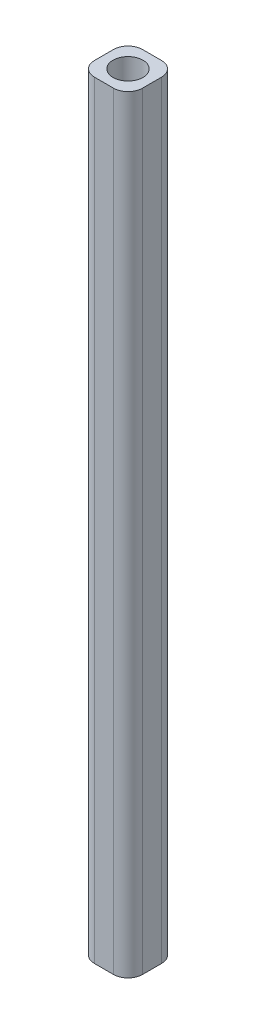
ISO-10303-21;
HEADER;
FILE_DESCRIPTION(('STEP AP214'),'2;1');
FILE_NAME('part.step','',(''),(''),'','','');
FILE_SCHEMA(('AUTOMOTIVE_DESIGN { 1 0 10303 214 1 1 1 1 }'));
ENDSEC;
DATA;
#1=APPLICATION_CONTEXT('core data for automotive mechanical design processes');
#2=APPLICATION_PROTOCOL_DEFINITION('international standard','automotive_design',2000,#1);
#3=PRODUCT_CONTEXT('',#1,'mechanical');
#4=PRODUCT('Part','Part','',(#3));
#5=PRODUCT_RELATED_PRODUCT_CATEGORY('part','',(#4));
#6=PRODUCT_DEFINITION_FORMATION('','',#4);
#7=PRODUCT_DEFINITION_CONTEXT('part definition',#1,'design');
#8=PRODUCT_DEFINITION('design','',#6,#7);
#9=PRODUCT_DEFINITION_SHAPE('','',#8);
#10=(LENGTH_UNIT() NAMED_UNIT(*) SI_UNIT(.MILLI.,.METRE.));
#11=(NAMED_UNIT(*) PLANE_ANGLE_UNIT() SI_UNIT($,.RADIAN.));
#12=(NAMED_UNIT(*) SI_UNIT($,.STERADIAN.) SOLID_ANGLE_UNIT());
#13=UNCERTAINTY_MEASURE_WITH_UNIT(LENGTH_MEASURE(1.E-05),#10,'distance_accuracy_value','');
#14=(GEOMETRIC_REPRESENTATION_CONTEXT(3) GLOBAL_UNCERTAINTY_ASSIGNED_CONTEXT((#13)) GLOBAL_UNIT_ASSIGNED_CONTEXT((#10,
#11,#12)) REPRESENTATION_CONTEXT('',''));
#15=CARTESIAN_POINT('',(0.,0.,0.));
#16=DIRECTION('',(0.,0.,1.));
#17=DIRECTION('',(1.,0.,0.));
#18=AXIS2_PLACEMENT_3D('',#15,#16,#17);
#19=CARTESIAN_POINT('',(5.,160.,-5.));
#20=DIRECTION('',(-1.,0.,0.));
#21=DIRECTION('',(0.,0.,1.));
#22=AXIS2_PLACEMENT_3D('',#19,#20,#21);
#23=PLANE('',#22);
#24=DIRECTION('',(0.,0.,-1.));
#25=VECTOR('',#24,1.);
#26=CARTESIAN_POINT('',(5.,0.,-5.));
#27=LINE('',#26,#25);
#28=CARTESIAN_POINT('',(5.,0.,2.));
#29=VERTEX_POINT('',#28);
#30=CARTESIAN_POINT('',(5.,0.,-2.));
#31=VERTEX_POINT('',#30);
#32=EDGE_CURVE('E132',#29,#31,#27,.T.);
#33=ORIENTED_EDGE('',*,*,#32,.T.);
#34=DIRECTION('',(0.,-1.,0.));
#35=VECTOR('',#34,1.);
#36=CARTESIAN_POINT('',(5.,160.,-2.));
#37=LINE('',#36,#35);
#38=CARTESIAN_POINT('',(5.,160.,-2.));
#39=VERTEX_POINT('',#38);
#40=EDGE_CURVE('E11',#31,#39,#37,.F.);
#41=ORIENTED_EDGE('',*,*,#40,.T.);
#42=DIRECTION('',(0.,0.,-1.));
#43=VECTOR('',#42,1.);
#44=CARTESIAN_POINT('',(5.,160.,-5.));
#45=LINE('',#44,#43);
#46=CARTESIAN_POINT('',(5.,160.,2.));
#47=VERTEX_POINT('',#46);
#48=EDGE_CURVE('E130',#47,#39,#45,.T.);
#49=ORIENTED_EDGE('',*,*,#48,.F.);
#50=DIRECTION('',(0.,-1.,0.));
#51=VECTOR('',#50,1.);
#52=CARTESIAN_POINT('',(5.,160.,2.));
#53=LINE('',#52,#51);
#54=EDGE_CURVE('E44',#47,#29,#53,.T.);
#55=ORIENTED_EDGE('',*,*,#54,.T.);
#56=EDGE_LOOP('',(#33,#41,#49,#55));
#57=FACE_BOUND('',#56,.T.);
#58=ADVANCED_FACE('F36',(#57),#23,.F.);
#59=CARTESIAN_POINT('',(-5.,160.,-5.));
#60=DIRECTION('',(0.,0.,1.));
#61=DIRECTION('',(1.,0.,0.));
#62=AXIS2_PLACEMENT_3D('',#59,#60,#61);
#63=PLANE('',#62);
#64=DIRECTION('',(-1.,0.,0.));
#65=VECTOR('',#64,1.);
#66=CARTESIAN_POINT('',(-5.,0.,-5.));
#67=LINE('',#66,#65);
#68=CARTESIAN_POINT('',(2.,0.,-5.));
#69=VERTEX_POINT('',#68);
#70=CARTESIAN_POINT('',(-2.,0.,-5.));
#71=VERTEX_POINT('',#70);
#72=EDGE_CURVE('E128',#69,#71,#67,.T.);
#73=ORIENTED_EDGE('',*,*,#72,.T.);
#74=DIRECTION('',(0.,-1.,0.));
#75=VECTOR('',#74,1.);
#76=CARTESIAN_POINT('',(-2.,160.,-5.));
#77=LINE('',#76,#75);
#78=CARTESIAN_POINT('',(-2.,160.,-5.));
#79=VERTEX_POINT('',#78);
#80=EDGE_CURVE('E107',#71,#79,#77,.F.);
#81=ORIENTED_EDGE('',*,*,#80,.T.);
#82=DIRECTION('',(-1.,0.,0.));
#83=VECTOR('',#82,1.);
#84=CARTESIAN_POINT('',(-5.,160.,-5.));
#85=LINE('',#84,#83);
#86=CARTESIAN_POINT('',(2.,160.,-5.));
#87=VERTEX_POINT('',#86);
#88=EDGE_CURVE('E172',#87,#79,#85,.T.);
#89=ORIENTED_EDGE('',*,*,#88,.F.);
#90=DIRECTION('',(0.,-1.,0.));
#91=VECTOR('',#90,1.);
#92=CARTESIAN_POINT('',(2.,160.,-5.));
#93=LINE('',#92,#91);
#94=EDGE_CURVE('E112',#87,#69,#93,.T.);
#95=ORIENTED_EDGE('',*,*,#94,.T.);
#96=EDGE_LOOP('',(#73,#81,#89,#95));
#97=FACE_BOUND('',#96,.T.);
#98=ADVANCED_FACE('F197',(#97),#63,.F.);
#99=CARTESIAN_POINT('',(-5.,160.,-5.));
#100=DIRECTION('',(1.,0.,0.));
#101=DIRECTION('',(0.,0.,-1.));
#102=AXIS2_PLACEMENT_3D('',#99,#100,#101);
#103=PLANE('',#102);
#104=DIRECTION('',(0.,0.,1.));
#105=VECTOR('',#104,1.);
#106=CARTESIAN_POINT('',(-5.,160.,-5.));
#107=LINE('',#106,#105);
#108=CARTESIAN_POINT('',(-5.,160.,-2.));
#109=VERTEX_POINT('',#108);
#110=CARTESIAN_POINT('',(-5.,160.,2.));
#111=VERTEX_POINT('',#110);
#112=EDGE_CURVE('E121',#109,#111,#107,.T.);
#113=ORIENTED_EDGE('',*,*,#112,.F.);
#114=DIRECTION('',(0.,-1.,0.));
#115=VECTOR('',#114,1.);
#116=CARTESIAN_POINT('',(-5.,160.,-2.));
#117=LINE('',#116,#115);
#118=CARTESIAN_POINT('',(-5.,0.,-2.));
#119=VERTEX_POINT('',#118);
#120=EDGE_CURVE('E106',#109,#119,#117,.T.);
#121=ORIENTED_EDGE('',*,*,#120,.T.);
#122=DIRECTION('',(0.,0.,1.));
#123=VECTOR('',#122,1.);
#124=CARTESIAN_POINT('',(-5.,0.,-5.));
#125=LINE('',#124,#123);
#126=CARTESIAN_POINT('',(-5.,0.,2.));
#127=VERTEX_POINT('',#126);
#128=EDGE_CURVE('E119',#119,#127,#125,.T.);
#129=ORIENTED_EDGE('',*,*,#128,.T.);
#130=DIRECTION('',(0.,-1.,0.));
#131=VECTOR('',#130,1.);
#132=CARTESIAN_POINT('',(-5.,160.,2.));
#133=LINE('',#132,#131);
#134=EDGE_CURVE('E123',#127,#111,#133,.F.);
#135=ORIENTED_EDGE('',*,*,#134,.T.);
#136=EDGE_LOOP('',(#113,#121,#129,#135));
#137=FACE_BOUND('',#136,.T.);
#138=ADVANCED_FACE('F118',(#137),#103,.F.);
#139=CARTESIAN_POINT('',(-5.,160.,5.));
#140=DIRECTION('',(0.,0.,-1.));
#141=DIRECTION('',(-1.,0.,0.));
#142=AXIS2_PLACEMENT_3D('',#139,#140,#141);
#143=PLANE('',#142);
#144=DIRECTION('',(1.,0.,0.));
#145=VECTOR('',#144,1.);
#146=CARTESIAN_POINT('',(-5.,160.,5.));
#147=LINE('',#146,#145);
#148=CARTESIAN_POINT('',(-2.,160.,5.));
#149=VERTEX_POINT('',#148);
#150=CARTESIAN_POINT('',(2.,160.,5.));
#151=VERTEX_POINT('',#150);
#152=EDGE_CURVE('E136',#149,#151,#147,.T.);
#153=ORIENTED_EDGE('',*,*,#152,.F.);
#154=DIRECTION('',(0.,-1.,0.));
#155=VECTOR('',#154,1.);
#156=CARTESIAN_POINT('',(-2.,160.,5.));
#157=LINE('',#156,#155);
#158=CARTESIAN_POINT('',(-2.,0.,5.));
#159=VERTEX_POINT('',#158);
#160=EDGE_CURVE('E153',#149,#159,#157,.T.);
#161=ORIENTED_EDGE('',*,*,#160,.T.);
#162=DIRECTION('',(1.,0.,0.));
#163=VECTOR('',#162,1.);
#164=CARTESIAN_POINT('',(-5.,0.,5.));
#165=LINE('',#164,#163);
#166=CARTESIAN_POINT('',(2.,0.,5.));
#167=VERTEX_POINT('',#166);
#168=EDGE_CURVE('E127',#159,#167,#165,.T.);
#169=ORIENTED_EDGE('',*,*,#168,.T.);
#170=DIRECTION('',(0.,-1.,0.));
#171=VECTOR('',#170,1.);
#172=CARTESIAN_POINT('',(2.,160.,5.));
#173=LINE('',#172,#171);
#174=EDGE_CURVE('E51',#167,#151,#173,.F.);
#175=ORIENTED_EDGE('',*,*,#174,.T.);
#176=EDGE_LOOP('',(#153,#161,#169,#175));
#177=FACE_BOUND('',#176,.T.);
#178=ADVANCED_FACE('F223',(#177),#143,.F.);
#179=CARTESIAN_POINT('',(0.,160.,0.));
#180=DIRECTION('',(0.,1.,0.));
#181=DIRECTION('',(0.,0.,1.));
#182=AXIS2_PLACEMENT_3D('',#179,#180,#181);
#183=PLANE('',#182);
#184=CARTESIAN_POINT('',(0.,160.,0.));
#185=DIRECTION('',(0.,1.,0.));
#186=DIRECTION('',(0.,0.,1.));
#187=AXIS2_PLACEMENT_3D('',#184,#185,#186);
#188=CIRCLE('',#187,3.125);
#189=CARTESIAN_POINT('',(0.,160.,3.125));
#190=VERTEX_POINT('',#189);
#191=EDGE_CURVE('E167',#190,#190,#188,.T.);
#192=ORIENTED_EDGE('',*,*,#191,.F.);
#193=EDGE_LOOP('',(#192));
#194=FACE_BOUND('',#193,.T.);
#195=ORIENTED_EDGE('',*,*,#88,.T.);
#196=CARTESIAN_POINT('',(-2.,160.,-2.));
#197=DIRECTION('',(0.,1.,0.));
#198=DIRECTION('',(0.,0.,1.));
#199=AXIS2_PLACEMENT_3D('',#196,#197,#198);
#200=CIRCLE('',#199,3.);
#201=EDGE_CURVE('E150',#79,#109,#200,.T.);
#202=ORIENTED_EDGE('',*,*,#201,.T.);
#203=ORIENTED_EDGE('',*,*,#112,.T.);
#204=CARTESIAN_POINT('',(-2.,160.,2.));
#205=DIRECTION('',(0.,1.,0.));
#206=DIRECTION('',(0.,0.,1.));
#207=AXIS2_PLACEMENT_3D('',#204,#205,#206);
#208=CIRCLE('',#207,3.);
#209=EDGE_CURVE('E58',#111,#149,#208,.T.);
#210=ORIENTED_EDGE('',*,*,#209,.T.);
#211=ORIENTED_EDGE('',*,*,#152,.T.);
#212=CARTESIAN_POINT('',(2.,160.,2.));
#213=DIRECTION('',(0.,1.,0.));
#214=DIRECTION('',(0.,0.,1.));
#215=AXIS2_PLACEMENT_3D('',#212,#213,#214);
#216=CIRCLE('',#215,3.);
#217=EDGE_CURVE('E145',#151,#47,#216,.T.);
#218=ORIENTED_EDGE('',*,*,#217,.T.);
#219=ORIENTED_EDGE('',*,*,#48,.T.);
#220=CARTESIAN_POINT('',(2.,160.,-2.));
#221=DIRECTION('',(0.,1.,0.));
#222=DIRECTION('',(0.,0.,1.));
#223=AXIS2_PLACEMENT_3D('',#220,#221,#222);
#224=CIRCLE('',#223,3.);
#225=EDGE_CURVE('E147',#39,#87,#224,.T.);
#226=ORIENTED_EDGE('',*,*,#225,.T.);
#227=EDGE_LOOP('',(#195,#202,#203,#210,#211,#218,#219,#226));
#228=FACE_BOUND('',#227,.T.);
#229=ADVANCED_FACE('F221',(#194,#228),#183,.T.);
#230=CARTESIAN_POINT('',(0.,0.,0.));
#231=DIRECTION('',(0.,1.,0.));
#232=DIRECTION('',(0.,0.,1.));
#233=AXIS2_PLACEMENT_3D('',#230,#231,#232);
#234=PLANE('',#233);
#235=CARTESIAN_POINT('',(0.,0.,0.));
#236=DIRECTION('',(0.,1.,0.));
#237=DIRECTION('',(0.,0.,1.));
#238=AXIS2_PLACEMENT_3D('',#235,#236,#237);
#239=CIRCLE('',#238,3.125);
#240=CARTESIAN_POINT('',(0.,0.,3.125));
#241=VERTEX_POINT('',#240);
#242=EDGE_CURVE('E179',#241,#241,#239,.T.);
#243=ORIENTED_EDGE('',*,*,#242,.T.);
#244=EDGE_LOOP('',(#243));
#245=FACE_BOUND('',#244,.T.);
#246=ORIENTED_EDGE('',*,*,#128,.F.);
#247=CARTESIAN_POINT('',(-2.,0.,-2.));
#248=DIRECTION('',(0.,1.,0.));
#249=DIRECTION('',(0.,0.,1.));
#250=AXIS2_PLACEMENT_3D('',#247,#248,#249);
#251=CIRCLE('',#250,3.);
#252=EDGE_CURVE('E102',#119,#71,#251,.F.);
#253=ORIENTED_EDGE('',*,*,#252,.T.);
#254=ORIENTED_EDGE('',*,*,#72,.F.);
#255=CARTESIAN_POINT('',(2.,0.,-2.));
#256=DIRECTION('',(0.,1.,0.));
#257=DIRECTION('',(0.,0.,1.));
#258=AXIS2_PLACEMENT_3D('',#255,#256,#257);
#259=CIRCLE('',#258,3.);
#260=EDGE_CURVE('E139',#69,#31,#259,.F.);
#261=ORIENTED_EDGE('',*,*,#260,.T.);
#262=ORIENTED_EDGE('',*,*,#32,.F.);
#263=CARTESIAN_POINT('',(2.,0.,2.));
#264=DIRECTION('',(0.,1.,0.));
#265=DIRECTION('',(0.,0.,1.));
#266=AXIS2_PLACEMENT_3D('',#263,#264,#265);
#267=CIRCLE('',#266,3.);
#268=EDGE_CURVE('E122',#29,#167,#267,.F.);
#269=ORIENTED_EDGE('',*,*,#268,.T.);
#270=ORIENTED_EDGE('',*,*,#168,.F.);
#271=CARTESIAN_POINT('',(-2.,0.,2.));
#272=DIRECTION('',(0.,1.,0.));
#273=DIRECTION('',(0.,0.,1.));
#274=AXIS2_PLACEMENT_3D('',#271,#272,#273);
#275=CIRCLE('',#274,3.);
#276=EDGE_CURVE('E113',#159,#127,#275,.F.);
#277=ORIENTED_EDGE('',*,*,#276,.T.);
#278=EDGE_LOOP('',(#246,#253,#254,#261,#262,#269,#270,#277));
#279=FACE_BOUND('',#278,.T.);
#280=ADVANCED_FACE('F125',(#245,#279),#234,.F.);
#281=CARTESIAN_POINT('',(-2.,160.,-2.));
#282=DIRECTION('',(0.,-1.,0.));
#283=DIRECTION('',(0.,0.,-1.));
#284=AXIS2_PLACEMENT_3D('',#281,#282,#283);
#285=CYLINDRICAL_SURFACE('',#284,3.);
#286=ORIENTED_EDGE('',*,*,#201,.F.);
#287=ORIENTED_EDGE('',*,*,#80,.F.);
#288=ORIENTED_EDGE('',*,*,#252,.F.);
#289=ORIENTED_EDGE('',*,*,#120,.F.);
#290=EDGE_LOOP('',(#286,#287,#288,#289));
#291=FACE_BOUND('',#290,.T.);
#292=ADVANCED_FACE('F105',(#291),#285,.T.);
#293=CARTESIAN_POINT('',(-2.,160.,2.));
#294=DIRECTION('',(0.,-1.,0.));
#295=DIRECTION('',(0.,0.,-1.));
#296=AXIS2_PLACEMENT_3D('',#293,#294,#295);
#297=CYLINDRICAL_SURFACE('',#296,3.);
#298=ORIENTED_EDGE('',*,*,#209,.F.);
#299=ORIENTED_EDGE('',*,*,#134,.F.);
#300=ORIENTED_EDGE('',*,*,#276,.F.);
#301=ORIENTED_EDGE('',*,*,#160,.F.);
#302=EDGE_LOOP('',(#298,#299,#300,#301));
#303=FACE_BOUND('',#302,.T.);
#304=ADVANCED_FACE('F208',(#303),#297,.T.);
#305=CARTESIAN_POINT('',(2.,160.,-2.));
#306=DIRECTION('',(0.,-1.,0.));
#307=DIRECTION('',(0.,0.,-1.));
#308=AXIS2_PLACEMENT_3D('',#305,#306,#307);
#309=CYLINDRICAL_SURFACE('',#308,3.);
#310=ORIENTED_EDGE('',*,*,#225,.F.);
#311=ORIENTED_EDGE('',*,*,#40,.F.);
#312=ORIENTED_EDGE('',*,*,#260,.F.);
#313=ORIENTED_EDGE('',*,*,#94,.F.);
#314=EDGE_LOOP('',(#310,#311,#312,#313));
#315=FACE_BOUND('',#314,.T.);
#316=ADVANCED_FACE('F210',(#315),#309,.T.);
#317=CARTESIAN_POINT('',(2.,160.,2.));
#318=DIRECTION('',(0.,-1.,0.));
#319=DIRECTION('',(0.,0.,-1.));
#320=AXIS2_PLACEMENT_3D('',#317,#318,#319);
#321=CYLINDRICAL_SURFACE('',#320,3.);
#322=ORIENTED_EDGE('',*,*,#217,.F.);
#323=ORIENTED_EDGE('',*,*,#174,.F.);
#324=ORIENTED_EDGE('',*,*,#268,.F.);
#325=ORIENTED_EDGE('',*,*,#54,.F.);
#326=EDGE_LOOP('',(#322,#323,#324,#325));
#327=FACE_BOUND('',#326,.T.);
#328=ADVANCED_FACE('F38',(#327),#321,.T.);
#329=CARTESIAN_POINT('',(0.,155.3,0.));
#330=DIRECTION('',(0.,1.,0.));
#331=DIRECTION('',(0.,0.,1.));
#332=AXIS2_PLACEMENT_3D('',#329,#330,#331);
#333=CYLINDRICAL_SURFACE('',#332,3.125);
#334=CARTESIAN_POINT('',(0.,155.3,0.));
#335=DIRECTION('',(0.,1.,0.));
#336=DIRECTION('',(0.,0.,1.));
#337=AXIS2_PLACEMENT_3D('',#334,#335,#336);
#338=CIRCLE('',#337,3.125);
#339=CARTESIAN_POINT('',(0.,155.3,3.125));
#340=VERTEX_POINT('',#339);
#341=EDGE_CURVE('E165',#340,#340,#338,.T.);
#342=ORIENTED_EDGE('',*,*,#341,.F.);
#343=EDGE_LOOP('',(#342));
#344=FACE_BOUND('',#343,.T.);
#345=ORIENTED_EDGE('',*,*,#191,.T.);
#346=EDGE_LOOP('',(#345));
#347=FACE_BOUND('',#346,.T.);
#348=ADVANCED_FACE('F217',(#344,#347),#333,.F.);
#349=CARTESIAN_POINT('',(0.,155.3,0.));
#350=DIRECTION('',(0.,1.,0.));
#351=DIRECTION('',(0.,0.,1.));
#352=AXIS2_PLACEMENT_3D('',#349,#350,#351);
#353=PLANE('',#352);
#354=ORIENTED_EDGE('',*,*,#341,.T.);
#355=EDGE_LOOP('',(#354));
#356=FACE_BOUND('',#355,.T.);
#357=ADVANCED_FACE('F194',(#356),#353,.T.);
#358=CARTESIAN_POINT('',(0.,4.7,0.));
#359=DIRECTION('',(0.,-1.,0.));
#360=DIRECTION('',(0.,0.,-1.));
#361=AXIS2_PLACEMENT_3D('',#358,#359,#360);
#362=CYLINDRICAL_SURFACE('',#361,3.125);
#363=CARTESIAN_POINT('',(0.,4.7,0.));
#364=DIRECTION('',(0.,1.,0.));
#365=DIRECTION('',(0.,0.,1.));
#366=AXIS2_PLACEMENT_3D('',#363,#364,#365);
#367=CIRCLE('',#366,3.125);
#368=CARTESIAN_POINT('',(0.,4.7,3.125));
#369=VERTEX_POINT('',#368);
#370=EDGE_CURVE('E177',#369,#369,#367,.T.);
#371=ORIENTED_EDGE('',*,*,#370,.T.);
#372=EDGE_LOOP('',(#371));
#373=FACE_BOUND('',#372,.T.);
#374=ORIENTED_EDGE('',*,*,#242,.F.);
#375=EDGE_LOOP('',(#374));
#376=FACE_BOUND('',#375,.T.);
#377=ADVANCED_FACE('F185',(#373,#376),#362,.F.);
#378=CARTESIAN_POINT('',(0.,4.7,0.));
#379=DIRECTION('',(0.,1.,0.));
#380=DIRECTION('',(0.,0.,1.));
#381=AXIS2_PLACEMENT_3D('',#378,#379,#380);
#382=PLANE('',#381);
#383=ORIENTED_EDGE('',*,*,#370,.F.);
#384=EDGE_LOOP('',(#383));
#385=FACE_BOUND('',#384,.T.);
#386=ADVANCED_FACE('F188',(#385),#382,.F.);
#387=CLOSED_SHELL('',(#58,#98,#138,#178,#229,#280,#292,#304,#316,#328,#348,#357,#377,#386));
#388=MANIFOLD_SOLID_BREP('B2',#387);
#389=ADVANCED_BREP_SHAPE_REPRESENTATION('',(#18,#388),#14);
#390=SHAPE_DEFINITION_REPRESENTATION(#9,#389);
ENDSEC;
END-ISO-10303-21;
